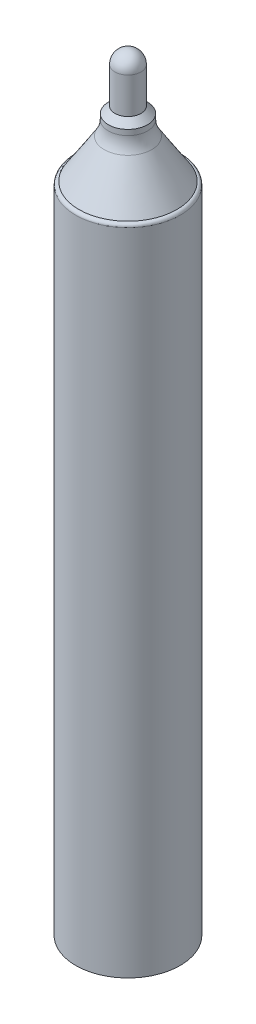
ISO-10303-21;
HEADER;
FILE_DESCRIPTION(('STEP AP214'),'2;1');
FILE_NAME('part.step','',(''),(''),'','','');
FILE_SCHEMA(('AUTOMOTIVE_DESIGN { 1 0 10303 214 1 1 1 1 }'));
ENDSEC;
DATA;
#1=APPLICATION_CONTEXT('core data for automotive mechanical design processes');
#2=APPLICATION_PROTOCOL_DEFINITION('international standard','automotive_design',2000,#1);
#3=PRODUCT_CONTEXT('',#1,'mechanical');
#4=PRODUCT('Part','Part','',(#3));
#5=PRODUCT_RELATED_PRODUCT_CATEGORY('part','',(#4));
#6=PRODUCT_DEFINITION_FORMATION('','',#4);
#7=PRODUCT_DEFINITION_CONTEXT('part definition',#1,'design');
#8=PRODUCT_DEFINITION('design','',#6,#7);
#9=PRODUCT_DEFINITION_SHAPE('','',#8);
#10=(LENGTH_UNIT() NAMED_UNIT(*) SI_UNIT(.MILLI.,.METRE.));
#11=(NAMED_UNIT(*) PLANE_ANGLE_UNIT() SI_UNIT($,.RADIAN.));
#12=(NAMED_UNIT(*) SI_UNIT($,.STERADIAN.) SOLID_ANGLE_UNIT());
#13=UNCERTAINTY_MEASURE_WITH_UNIT(LENGTH_MEASURE(1.E-05),#10,'distance_accuracy_value','');
#14=(GEOMETRIC_REPRESENTATION_CONTEXT(3) GLOBAL_UNCERTAINTY_ASSIGNED_CONTEXT((#13)) GLOBAL_UNIT_ASSIGNED_CONTEXT((#10,
#11,#12)) REPRESENTATION_CONTEXT('',''));
#15=CARTESIAN_POINT('',(0.,0.,0.));
#16=DIRECTION('',(0.,0.,1.));
#17=DIRECTION('',(1.,0.,0.));
#18=AXIS2_PLACEMENT_3D('',#15,#16,#17);
#19=CARTESIAN_POINT('',(0.,100.,0.));
#20=DIRECTION('',(0.,-1.,0.));
#21=DIRECTION('',(0.,0.,-1.));
#22=AXIS2_PLACEMENT_3D('',#19,#20,#21);
#23=CYLINDRICAL_SURFACE('',#22,8.);
#24=CARTESIAN_POINT('',(0.,99.5,0.));
#25=DIRECTION('',(0.,1.,0.));
#26=DIRECTION('',(0.,0.,1.));
#27=AXIS2_PLACEMENT_3D('',#24,#25,#26);
#28=CIRCLE('',#27,8.);
#29=CARTESIAN_POINT('',(0.,99.5,8.));
#30=VERTEX_POINT('',#29);
#31=EDGE_CURVE('E63',#30,#30,#28,.F.);
#32=ORIENTED_EDGE('',*,*,#31,.T.);
#33=EDGE_LOOP('',(#32));
#34=FACE_BOUND('',#33,.T.);
#35=CARTESIAN_POINT('',(0.,0.,0.));
#36=DIRECTION('',(0.,1.,0.));
#37=DIRECTION('',(0.,0.,1.));
#38=AXIS2_PLACEMENT_3D('',#35,#36,#37);
#39=CIRCLE('',#38,8.);
#40=CARTESIAN_POINT('',(0.,0.,8.));
#41=VERTEX_POINT('',#40);
#42=EDGE_CURVE('E64',#41,#41,#39,.T.);
#43=ORIENTED_EDGE('',*,*,#42,.T.);
#44=EDGE_LOOP('',(#43));
#45=FACE_BOUND('',#44,.T.);
#46=ADVANCED_FACE('F39',(#34,#45),#23,.T.);
#47=CARTESIAN_POINT('',(0.,0.,0.));
#48=DIRECTION('',(0.,1.,0.));
#49=DIRECTION('',(0.,0.,1.));
#50=AXIS2_PLACEMENT_3D('',#47,#48,#49);
#51=PLANE('',#50);
#52=ORIENTED_EDGE('',*,*,#42,.F.);
#53=EDGE_LOOP('',(#52));
#54=FACE_BOUND('',#53,.T.);
#55=ADVANCED_FACE('F91',(#54),#51,.F.);
#56=CARTESIAN_POINT('',(0.,100.,0.));
#57=DIRECTION('',(0.,1.,0.));
#58=DIRECTION('',(-1.,0.,0.));
#59=AXIS2_PLACEMENT_3D('',#56,#57,#58);
#60=CYLINDRICAL_SURFACE('',#59,3.00000000000003);
#61=CARTESIAN_POINT('',(0.,109.,0.));
#62=DIRECTION('',(0.,-1.,0.));
#63=DIRECTION('',(1.,0.,0.));
#64=AXIS2_PLACEMENT_3D('',#61,#62,#63);
#65=CIRCLE('',#64,3.00000000000003);
#66=CARTESIAN_POINT('',(3.,109.,0.));
#67=VERTEX_POINT('',#66);
#68=EDGE_CURVE('E10',#67,#67,#65,.T.);
#69=ORIENTED_EDGE('',*,*,#68,.T.);
#70=EDGE_LOOP('',(#69));
#71=FACE_BOUND('',#70,.T.);
#72=CARTESIAN_POINT('',(0.,108.174807545375,0.));
#73=DIRECTION('',(0.,1.,0.));
#74=DIRECTION('',(-1.,0.,0.));
#75=AXIS2_PLACEMENT_3D('',#72,#73,#74);
#76=CIRCLE('',#75,3.00000000000003);
#77=CARTESIAN_POINT('',(-3.00000000000006,108.174807545375,0.));
#78=VERTEX_POINT('',#77);
#79=EDGE_CURVE('E56',#78,#78,#76,.T.);
#80=ORIENTED_EDGE('',*,*,#79,.T.);
#81=EDGE_LOOP('',(#80));
#82=FACE_BOUND('',#81,.T.);
#83=ADVANCED_FACE('F72',(#71,#82),#60,.T.);
#84=CARTESIAN_POINT('',(0.,100.,0.));
#85=DIRECTION('',(0.,-1.,0.));
#86=DIRECTION('',(1.,0.,0.));
#87=AXIS2_PLACEMENT_3D('',#84,#85,#86);
#88=CONICAL_SURFACE('',#87,7.5,0.571337479833624);
#89=CARTESIAN_POINT('',(0.,106.011777180121,0.));
#90=DIRECTION('',(0.,-1.,0.));
#91=DIRECTION('',(1.,0.,0.));
#92=AXIS2_PLACEMENT_3D('',#89,#90,#91);
#93=CIRCLE('',#92,3.63528609849381);
#94=CARTESIAN_POINT('',(3.63528609849379,106.011777180121,0.));
#95=VERTEX_POINT('',#94);
#96=EDGE_CURVE('E51',#95,#95,#93,.T.);
#97=ORIENTED_EDGE('',*,*,#96,.T.);
#98=EDGE_LOOP('',(#97));
#99=FACE_BOUND('',#98,.T.);
#100=CARTESIAN_POINT('',(0.,100.,0.));
#101=DIRECTION('',(0.,1.,0.));
#102=DIRECTION('',(-1.,0.,0.));
#103=AXIS2_PLACEMENT_3D('',#100,#101,#102);
#104=CIRCLE('',#103,7.5);
#105=CARTESIAN_POINT('',(-7.5,99.9999999999999,0.));
#106=VERTEX_POINT('',#105);
#107=EDGE_CURVE('E60',#106,#106,#104,.T.);
#108=ORIENTED_EDGE('',*,*,#107,.T.);
#109=EDGE_LOOP('',(#108));
#110=FACE_BOUND('',#109,.T.);
#111=ADVANCED_FACE('F86',(#99,#110),#88,.T.);
#112=CARTESIAN_POINT('',(0.,99.5,0.));
#113=DIRECTION('',(0.,1.,0.));
#114=DIRECTION('',(0.,0.,1.));
#115=AXIS2_PLACEMENT_3D('',#112,#113,#114);
#116=TOROIDAL_SURFACE('',#115,7.5,0.5);
#117=ORIENTED_EDGE('',*,*,#31,.F.);
#118=EDGE_LOOP('',(#117));
#119=FACE_BOUND('',#118,.T.);
#120=ORIENTED_EDGE('',*,*,#107,.F.);
#121=EDGE_LOOP('',(#120));
#122=FACE_BOUND('',#121,.T.);
#123=ADVANCED_FACE('F77',(#119,#122),#116,.T.);
#124=CARTESIAN_POINT('',(0.,108.174807545375,0.));
#125=DIRECTION('',(0.,1.,0.));
#126=DIRECTION('',(-1.,0.,0.));
#127=AXIS2_PLACEMENT_3D('',#124,#125,#126);
#128=TOROIDAL_SURFACE('',#127,7.00000000000003,4.);
#129=ORIENTED_EDGE('',*,*,#96,.F.);
#130=EDGE_LOOP('',(#129));
#131=FACE_BOUND('',#130,.T.);
#132=ORIENTED_EDGE('',*,*,#79,.F.);
#133=EDGE_LOOP('',(#132));
#134=FACE_BOUND('',#133,.T.);
#135=ADVANCED_FACE('F74',(#131,#134),#128,.F.);
#136=CARTESIAN_POINT('',(0.,110.,0.));
#137=DIRECTION('',(0.,1.,0.));
#138=DIRECTION('',(-1.,0.,0.));
#139=AXIS2_PLACEMENT_3D('',#136,#137,#138);
#140=CYLINDRICAL_SURFACE('',#139,2.00000000000005);
#141=CARTESIAN_POINT('',(0.,115.5,0.));
#142=DIRECTION('',(0.,1.,0.));
#143=DIRECTION('',(-1.,0.,0.));
#144=AXIS2_PLACEMENT_3D('',#141,#142,#143);
#145=CIRCLE('',#144,2.00000000000006);
#146=CARTESIAN_POINT('',(-2.00000000000011,115.5,0.));
#147=VERTEX_POINT('',#146);
#148=EDGE_CURVE('E59',#147,#147,#145,.T.);
#149=ORIENTED_EDGE('',*,*,#148,.F.);
#150=EDGE_LOOP('',(#149));
#151=FACE_BOUND('',#150,.T.);
#152=CARTESIAN_POINT('',(0.,110.,0.));
#153=DIRECTION('',(0.,1.,0.));
#154=DIRECTION('',(-1.,0.,0.));
#155=AXIS2_PLACEMENT_3D('',#152,#153,#154);
#156=CIRCLE('',#155,2.00000000000004);
#157=CARTESIAN_POINT('',(-2.00000000000007,110.,0.));
#158=VERTEX_POINT('',#157);
#159=EDGE_CURVE('E47',#158,#158,#156,.T.);
#160=ORIENTED_EDGE('',*,*,#159,.T.);
#161=EDGE_LOOP('',(#160));
#162=FACE_BOUND('',#161,.T.);
#163=ADVANCED_FACE('F76',(#151,#162),#140,.T.);
#164=CARTESIAN_POINT('',(0.,115.5,0.));
#165=DIRECTION('',(0.,1.,0.));
#166=DIRECTION('',(1.,0.,0.));
#167=AXIS2_PLACEMENT_3D('',#164,#165,#166);
#168=SPHERICAL_SURFACE('',#167,2.);
#169=ORIENTED_EDGE('',*,*,#148,.T.);
#170=EDGE_LOOP('',(#169));
#171=FACE_BOUND('',#170,.T.);
#172=ADVANCED_FACE('F83',(#171),#168,.T.);
#173=CARTESIAN_POINT('',(0.,110.,0.));
#174=DIRECTION('',(0.,-1.,0.));
#175=DIRECTION('',(1.,0.,0.));
#176=AXIS2_PLACEMENT_3D('',#173,#174,#175);
#177=CONICAL_SURFACE('',#176,2.00000000000003,0.785398163397442);
#178=ORIENTED_EDGE('',*,*,#68,.F.);
#179=EDGE_LOOP('',(#178));
#180=FACE_BOUND('',#179,.T.);
#181=ORIENTED_EDGE('',*,*,#159,.F.);
#182=EDGE_LOOP('',(#181));
#183=FACE_BOUND('',#182,.T.);
#184=ADVANCED_FACE('F42',(#180,#183),#177,.T.);
#185=CLOSED_SHELL('',(#46,#55,#83,#111,#123,#135,#163,#172,#184));
#186=MANIFOLD_SOLID_BREP('B2',#185);
#187=ADVANCED_BREP_SHAPE_REPRESENTATION('',(#18,#186),#14);
#188=SHAPE_DEFINITION_REPRESENTATION(#9,#187);
ENDSEC;
END-ISO-10303-21;
